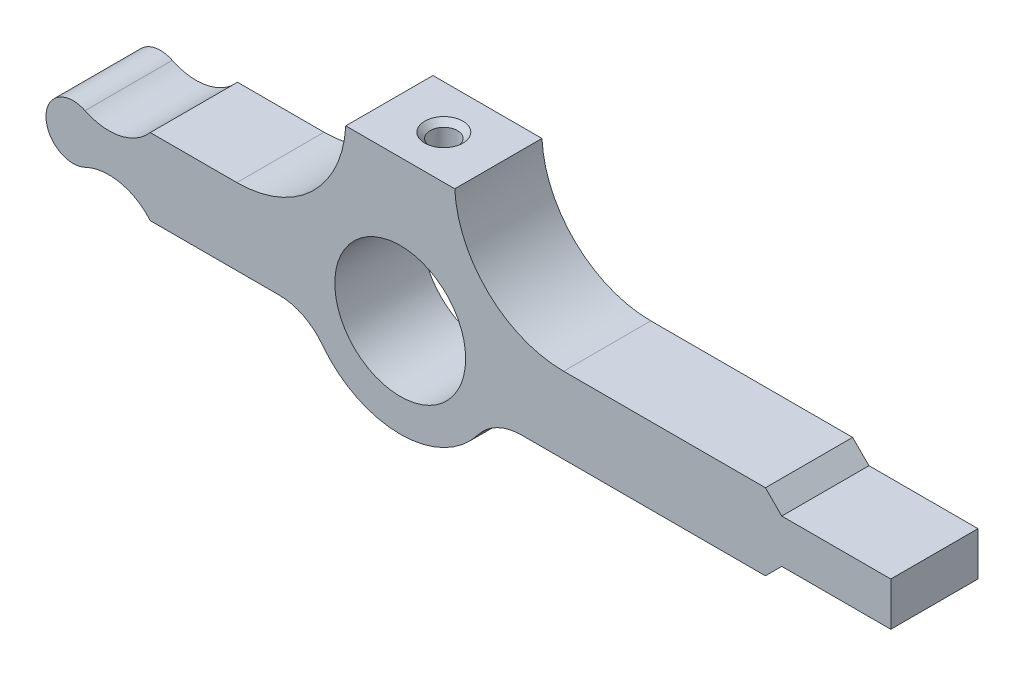
ISO-10303-21;
HEADER;
FILE_DESCRIPTION(('STEP AP214'),'2;1');
FILE_NAME('part.step','',(''),(''),'','','');
FILE_SCHEMA(('AUTOMOTIVE_DESIGN { 1 0 10303 214 1 1 1 1 }'));
ENDSEC;
DATA;
#1=APPLICATION_CONTEXT('core data for automotive mechanical design processes');
#2=APPLICATION_PROTOCOL_DEFINITION('international standard','automotive_design',2000,#1);
#3=PRODUCT_CONTEXT('',#1,'mechanical');
#4=PRODUCT('Part','Part','',(#3));
#5=PRODUCT_RELATED_PRODUCT_CATEGORY('part','',(#4));
#6=PRODUCT_DEFINITION_FORMATION('','',#4);
#7=PRODUCT_DEFINITION_CONTEXT('part definition',#1,'design');
#8=PRODUCT_DEFINITION('design','',#6,#7);
#9=PRODUCT_DEFINITION_SHAPE('','',#8);
#10=(LENGTH_UNIT() NAMED_UNIT(*) SI_UNIT(.MILLI.,.METRE.));
#11=(NAMED_UNIT(*) PLANE_ANGLE_UNIT() SI_UNIT($,.RADIAN.));
#12=(NAMED_UNIT(*) SI_UNIT($,.STERADIAN.) SOLID_ANGLE_UNIT());
#13=UNCERTAINTY_MEASURE_WITH_UNIT(LENGTH_MEASURE(1.E-05),#10,'distance_accuracy_value','');
#14=(GEOMETRIC_REPRESENTATION_CONTEXT(3) GLOBAL_UNCERTAINTY_ASSIGNED_CONTEXT((#13)) GLOBAL_UNIT_ASSIGNED_CONTEXT((#10,
#11,#12)) REPRESENTATION_CONTEXT('',''));
#15=CARTESIAN_POINT('',(0.,0.,0.));
#16=DIRECTION('',(0.,0.,1.));
#17=DIRECTION('',(1.,0.,0.));
#18=AXIS2_PLACEMENT_3D('',#15,#16,#17);
#19=CARTESIAN_POINT('',(11.1242977306435,-8.5,4.));
#20=DIRECTION('',(0.,0.,-1.));
#21=DIRECTION('',(-1.,0.,0.));
#22=AXIS2_PLACEMENT_3D('',#19,#20,#21);
#23=PLANE('',#22);
#24=CARTESIAN_POINT('',(11.1242977306435,-8.5,4.));
#25=DIRECTION('',(0.,0.,-1.));
#26=DIRECTION('',(-1.,0.,0.));
#27=AXIS2_PLACEMENT_3D('',#24,#25,#26);
#28=CIRCLE('',#27,5.);
#29=CARTESIAN_POINT('',(7.15133425541367,-5.46428571428571,4.));
#30=VERTEX_POINT('',#29);
#31=CARTESIAN_POINT('',(11.1242977306435,-3.5,4.));
#32=VERTEX_POINT('',#31);
#33=EDGE_CURVE('E231',#30,#32,#28,.T.);
#34=ORIENTED_EDGE('',*,*,#33,.T.);
#35=DIRECTION('',(1.,0.,0.));
#36=VECTOR('',#35,1.);
#37=CARTESIAN_POINT('',(11.1242977306435,-3.5,4.));
#38=LINE('',#37,#36);
#39=CARTESIAN_POINT('',(33.5,-3.5,4.));
#40=VERTEX_POINT('',#39);
#41=EDGE_CURVE('E129',#32,#40,#38,.T.);
#42=ORIENTED_EDGE('',*,*,#41,.T.);
#43=DIRECTION('',(0.707106781186546,0.707106781186549,0.));
#44=VECTOR('',#43,1.);
#45=CARTESIAN_POINT('',(33.5,-3.5,4.));
#46=LINE('',#45,#44);
#47=CARTESIAN_POINT('',(35.,-2.,4.));
#48=VERTEX_POINT('',#47);
#49=EDGE_CURVE('E276',#40,#48,#46,.T.);
#50=ORIENTED_EDGE('',*,*,#49,.T.);
#51=DIRECTION('',(1.,0.,0.));
#52=VECTOR('',#51,1.);
#53=CARTESIAN_POINT('',(35.,-2.,4.));
#54=LINE('',#53,#52);
#55=CARTESIAN_POINT('',(45.,-2.,4.));
#56=VERTEX_POINT('',#55);
#57=EDGE_CURVE('E295',#48,#56,#54,.T.);
#58=ORIENTED_EDGE('',*,*,#57,.T.);
#59=DIRECTION('',(0.,1.,0.));
#60=VECTOR('',#59,1.);
#61=CARTESIAN_POINT('',(45.,-2.,4.));
#62=LINE('',#61,#60);
#63=CARTESIAN_POINT('',(45.,2.,4.));
#64=VERTEX_POINT('',#63);
#65=EDGE_CURVE('E292',#56,#64,#62,.T.);
#66=ORIENTED_EDGE('',*,*,#65,.T.);
#67=DIRECTION('',(-1.,0.,0.));
#68=VECTOR('',#67,1.);
#69=CARTESIAN_POINT('',(45.,2.,4.));
#70=LINE('',#69,#68);
#71=CARTESIAN_POINT('',(35.,2.,4.));
#72=VERTEX_POINT('',#71);
#73=EDGE_CURVE('E294',#64,#72,#70,.T.);
#74=ORIENTED_EDGE('',*,*,#73,.T.);
#75=DIRECTION('',(-0.707106781186553,0.707106781186542,0.));
#76=VECTOR('',#75,1.);
#77=CARTESIAN_POINT('',(35.,2.,4.));
#78=LINE('',#77,#76);
#79=CARTESIAN_POINT('',(33.5,3.5,4.));
#80=VERTEX_POINT('',#79);
#81=EDGE_CURVE('E297',#72,#80,#78,.T.);
#82=ORIENTED_EDGE('',*,*,#81,.T.);
#83=DIRECTION('',(-1.,0.,0.));
#84=VECTOR('',#83,1.);
#85=CARTESIAN_POINT('',(33.5,3.5,4.));
#86=LINE('',#85,#84);
#87=CARTESIAN_POINT('',(14.9874921777191,3.5,4.));
#88=VERTEX_POINT('',#87);
#89=EDGE_CURVE('E303',#80,#88,#86,.T.);
#90=ORIENTED_EDGE('',*,*,#89,.T.);
#91=CARTESIAN_POINT('',(14.9874921777191,13.5,4.));
#92=DIRECTION('',(0.,0.,-1.));
#93=DIRECTION('',(1.,0.,0.));
#94=AXIS2_PLACEMENT_3D('',#91,#92,#93);
#95=CIRCLE('',#94,10.);
#96=CARTESIAN_POINT('',(5.,13.,4.));
#97=VERTEX_POINT('',#96);
#98=EDGE_CURVE('E305',#88,#97,#95,.T.);
#99=ORIENTED_EDGE('',*,*,#98,.T.);
#100=DIRECTION('',(-1.,0.,0.));
#101=VECTOR('',#100,1.);
#102=CARTESIAN_POINT('',(5.,13.,4.));
#103=LINE('',#102,#101);
#104=CARTESIAN_POINT('',(-5.,13.,4.));
#105=VERTEX_POINT('',#104);
#106=EDGE_CURVE('E307',#97,#105,#103,.T.);
#107=ORIENTED_EDGE('',*,*,#106,.T.);
#108=CARTESIAN_POINT('',(-14.9874921777191,13.5,4.));
#109=DIRECTION('',(0.,0.,-1.));
#110=DIRECTION('',(-1.,0.,0.));
#111=AXIS2_PLACEMENT_3D('',#108,#109,#110);
#112=CIRCLE('',#111,10.);
#113=CARTESIAN_POINT('',(-14.9874921777191,3.49999999999999,4.));
#114=VERTEX_POINT('',#113);
#115=EDGE_CURVE('E309',#105,#114,#112,.T.);
#116=ORIENTED_EDGE('',*,*,#115,.T.);
#117=DIRECTION('',(-1.,0.,0.));
#118=VECTOR('',#117,1.);
#119=CARTESIAN_POINT('',(-14.9874921777191,3.49999999999999,4.));
#120=LINE('',#119,#118);
#121=CARTESIAN_POINT('',(-22.9311547539518,3.49999999999999,4.));
#122=VERTEX_POINT('',#121);
#123=EDGE_CURVE('E311',#114,#122,#120,.T.);
#124=ORIENTED_EDGE('',*,*,#123,.T.);
#125=CARTESIAN_POINT('',(-26.7308257923445,6.75,4.));
#126=DIRECTION('',(0.,0.,-1.));
#127=DIRECTION('',(-1.,0.,0.));
#128=AXIS2_PLACEMENT_3D('',#125,#126,#127);
#129=CIRCLE('',#128,5.);
#130=CARTESIAN_POINT('',(-28.9102752641148,2.25,4.));
#131=VERTEX_POINT('',#130);
#132=EDGE_CURVE('E313',#122,#131,#129,.T.);
#133=ORIENTED_EDGE('',*,*,#132,.T.);
#134=CARTESIAN_POINT('',(-30.,0.,4.));
#135=DIRECTION('',(0.,0.,1.));
#136=DIRECTION('',(1.,0.,0.));
#137=AXIS2_PLACEMENT_3D('',#134,#135,#136);
#138=CIRCLE('',#137,2.5);
#139=CARTESIAN_POINT('',(-28.9102752641148,-2.25,4.));
#140=VERTEX_POINT('',#139);
#141=EDGE_CURVE('E315',#131,#140,#138,.T.);
#142=ORIENTED_EDGE('',*,*,#141,.T.);
#143=CARTESIAN_POINT('',(-26.7308257923445,-6.75,4.));
#144=DIRECTION('',(0.,0.,-1.));
#145=DIRECTION('',(-1.,0.,0.));
#146=AXIS2_PLACEMENT_3D('',#143,#144,#145);
#147=CIRCLE('',#146,5.);
#148=CARTESIAN_POINT('',(-22.9311547539518,-3.5,4.));
#149=VERTEX_POINT('',#148);
#150=EDGE_CURVE('E178',#140,#149,#147,.T.);
#151=ORIENTED_EDGE('',*,*,#150,.T.);
#152=DIRECTION('',(1.,0.,0.));
#153=VECTOR('',#152,1.);
#154=CARTESIAN_POINT('',(-22.9311547539518,-3.5,4.));
#155=LINE('',#154,#153);
#156=CARTESIAN_POINT('',(-11.1242977306435,-3.5,4.));
#157=VERTEX_POINT('',#156);
#158=EDGE_CURVE('E172',#149,#157,#155,.T.);
#159=ORIENTED_EDGE('',*,*,#158,.T.);
#160=CARTESIAN_POINT('',(-11.1242977306435,-8.5,4.));
#161=DIRECTION('',(0.,0.,-1.));
#162=DIRECTION('',(-1.,0.,0.));
#163=AXIS2_PLACEMENT_3D('',#160,#161,#162);
#164=CIRCLE('',#163,5.);
#165=CARTESIAN_POINT('',(-7.15133425541367,-5.46428571428571,4.));
#166=VERTEX_POINT('',#165);
#167=EDGE_CURVE('E176',#157,#166,#164,.T.);
#168=ORIENTED_EDGE('',*,*,#167,.T.);
#169=CARTESIAN_POINT('',(0.,0.,4.));
#170=DIRECTION('',(0.,0.,1.));
#171=DIRECTION('',(1.,0.,0.));
#172=AXIS2_PLACEMENT_3D('',#169,#170,#171);
#173=CIRCLE('',#172,9.);
#174=EDGE_CURVE('E56',#166,#30,#173,.T.);
#175=ORIENTED_EDGE('',*,*,#174,.T.);
#176=EDGE_LOOP('',(#34,#42,#50,#58,#66,#74,#82,#90,#99,#107,#116,#124,#133,#142,#151,#159,#168,#175));
#177=FACE_BOUND('',#176,.T.);
#178=CARTESIAN_POINT('',(0.,0.,4.));
#179=DIRECTION('',(0.,0.,1.));
#180=DIRECTION('',(1.,0.,0.));
#181=AXIS2_PLACEMENT_3D('',#178,#179,#180);
#182=CIRCLE('',#181,6.);
#183=CARTESIAN_POINT('',(6.,0.,4.));
#184=VERTEX_POINT('',#183);
#185=EDGE_CURVE('E200',#184,#184,#182,.T.);
#186=ORIENTED_EDGE('',*,*,#185,.F.);
#187=EDGE_LOOP('',(#186));
#188=FACE_BOUND('',#187,.T.);
#189=ADVANCED_FACE('F39',(#177,#188),#23,.F.);
#190=CARTESIAN_POINT('',(11.1242977306435,-8.5,-4.));
#191=DIRECTION('',(0.,0.,-1.));
#192=DIRECTION('',(-1.,0.,0.));
#193=AXIS2_PLACEMENT_3D('',#190,#191,#192);
#194=PLANE('',#193);
#195=CARTESIAN_POINT('',(11.1242977306435,-8.5,-4.));
#196=DIRECTION('',(0.,0.,-1.));
#197=DIRECTION('',(-1.,0.,0.));
#198=AXIS2_PLACEMENT_3D('',#195,#196,#197);
#199=CIRCLE('',#198,5.);
#200=CARTESIAN_POINT('',(7.15133425541367,-5.46428571428571,-4.));
#201=VERTEX_POINT('',#200);
#202=CARTESIAN_POINT('',(11.1242977306435,-3.5,-4.));
#203=VERTEX_POINT('',#202);
#204=EDGE_CURVE('E196',#201,#203,#199,.T.);
#205=ORIENTED_EDGE('',*,*,#204,.F.);
#206=CARTESIAN_POINT('',(0.,0.,-4.));
#207=DIRECTION('',(0.,0.,1.));
#208=DIRECTION('',(1.,0.,0.));
#209=AXIS2_PLACEMENT_3D('',#206,#207,#208);
#210=CIRCLE('',#209,9.);
#211=CARTESIAN_POINT('',(-7.15133425541367,-5.46428571428571,-4.));
#212=VERTEX_POINT('',#211);
#213=EDGE_CURVE('E121',#212,#201,#210,.T.);
#214=ORIENTED_EDGE('',*,*,#213,.F.);
#215=CARTESIAN_POINT('',(-11.1242977306435,-8.5,-4.));
#216=DIRECTION('',(0.,0.,-1.));
#217=DIRECTION('',(-1.,0.,0.));
#218=AXIS2_PLACEMENT_3D('',#215,#216,#217);
#219=CIRCLE('',#218,5.);
#220=CARTESIAN_POINT('',(-11.1242977306435,-3.5,-4.));
#221=VERTEX_POINT('',#220);
#222=EDGE_CURVE('E115',#221,#212,#219,.T.);
#223=ORIENTED_EDGE('',*,*,#222,.F.);
#224=DIRECTION('',(1.,0.,0.));
#225=VECTOR('',#224,1.);
#226=CARTESIAN_POINT('',(-22.9311547539518,-3.5,-4.));
#227=LINE('',#226,#225);
#228=CARTESIAN_POINT('',(-22.9311547539518,-3.5,-4.));
#229=VERTEX_POINT('',#228);
#230=EDGE_CURVE('E186',#229,#221,#227,.T.);
#231=ORIENTED_EDGE('',*,*,#230,.F.);
#232=CARTESIAN_POINT('',(-26.7308257923445,-6.75,-4.));
#233=DIRECTION('',(0.,0.,-1.));
#234=DIRECTION('',(-1.,0.,0.));
#235=AXIS2_PLACEMENT_3D('',#232,#233,#234);
#236=CIRCLE('',#235,5.);
#237=CARTESIAN_POINT('',(-28.9102752641148,-2.25,-4.));
#238=VERTEX_POINT('',#237);
#239=EDGE_CURVE('E226',#238,#229,#236,.T.);
#240=ORIENTED_EDGE('',*,*,#239,.F.);
#241=CARTESIAN_POINT('',(-30.,0.,-4.));
#242=DIRECTION('',(0.,0.,1.));
#243=DIRECTION('',(1.,0.,0.));
#244=AXIS2_PLACEMENT_3D('',#241,#242,#243);
#245=CIRCLE('',#244,2.5);
#246=CARTESIAN_POINT('',(-28.9102752641148,2.25,-4.));
#247=VERTEX_POINT('',#246);
#248=EDGE_CURVE('E224',#247,#238,#245,.T.);
#249=ORIENTED_EDGE('',*,*,#248,.F.);
#250=CARTESIAN_POINT('',(-26.7308257923445,6.75,-4.));
#251=DIRECTION('',(0.,0.,-1.));
#252=DIRECTION('',(-1.,0.,0.));
#253=AXIS2_PLACEMENT_3D('',#250,#251,#252);
#254=CIRCLE('',#253,5.);
#255=CARTESIAN_POINT('',(-22.9311547539518,3.49999999999999,-4.));
#256=VERTEX_POINT('',#255);
#257=EDGE_CURVE('E222',#256,#247,#254,.T.);
#258=ORIENTED_EDGE('',*,*,#257,.F.);
#259=DIRECTION('',(-1.,0.,0.));
#260=VECTOR('',#259,1.);
#261=CARTESIAN_POINT('',(-14.9874921777191,3.49999999999999,-4.));
#262=LINE('',#261,#260);
#263=CARTESIAN_POINT('',(-14.9874921777191,3.49999999999999,-4.));
#264=VERTEX_POINT('',#263);
#265=EDGE_CURVE('E220',#264,#256,#262,.T.);
#266=ORIENTED_EDGE('',*,*,#265,.F.);
#267=CARTESIAN_POINT('',(-14.9874921777191,13.5,-4.));
#268=DIRECTION('',(0.,0.,-1.));
#269=DIRECTION('',(-1.,0.,0.));
#270=AXIS2_PLACEMENT_3D('',#267,#268,#269);
#271=CIRCLE('',#270,10.);
#272=CARTESIAN_POINT('',(-5.,13.,-4.));
#273=VERTEX_POINT('',#272);
#274=EDGE_CURVE('E218',#273,#264,#271,.T.);
#275=ORIENTED_EDGE('',*,*,#274,.F.);
#276=DIRECTION('',(-1.,0.,0.));
#277=VECTOR('',#276,1.);
#278=CARTESIAN_POINT('',(5.,13.,-4.));
#279=LINE('',#278,#277);
#280=CARTESIAN_POINT('',(5.,13.,-4.));
#281=VERTEX_POINT('',#280);
#282=EDGE_CURVE('E216',#281,#273,#279,.T.);
#283=ORIENTED_EDGE('',*,*,#282,.F.);
#284=CARTESIAN_POINT('',(14.9874921777191,13.5,-4.));
#285=DIRECTION('',(0.,0.,-1.));
#286=DIRECTION('',(1.,0.,0.));
#287=AXIS2_PLACEMENT_3D('',#284,#285,#286);
#288=CIRCLE('',#287,10.);
#289=CARTESIAN_POINT('',(14.9874921777191,3.5,-4.));
#290=VERTEX_POINT('',#289);
#291=EDGE_CURVE('E214',#290,#281,#288,.T.);
#292=ORIENTED_EDGE('',*,*,#291,.F.);
#293=DIRECTION('',(-1.,0.,0.));
#294=VECTOR('',#293,1.);
#295=CARTESIAN_POINT('',(33.5,3.5,-4.));
#296=LINE('',#295,#294);
#297=CARTESIAN_POINT('',(33.5,3.5,-4.));
#298=VERTEX_POINT('',#297);
#299=EDGE_CURVE('E212',#298,#290,#296,.T.);
#300=ORIENTED_EDGE('',*,*,#299,.F.);
#301=DIRECTION('',(-0.707106781186553,0.707106781186542,0.));
#302=VECTOR('',#301,1.);
#303=CARTESIAN_POINT('',(35.,2.,-4.));
#304=LINE('',#303,#302);
#305=CARTESIAN_POINT('',(35.,2.,-4.));
#306=VERTEX_POINT('',#305);
#307=EDGE_CURVE('E210',#306,#298,#304,.T.);
#308=ORIENTED_EDGE('',*,*,#307,.F.);
#309=DIRECTION('',(-1.,0.,0.));
#310=VECTOR('',#309,1.);
#311=CARTESIAN_POINT('',(45.,2.,-4.));
#312=LINE('',#311,#310);
#313=CARTESIAN_POINT('',(45.,2.,-4.));
#314=VERTEX_POINT('',#313);
#315=EDGE_CURVE('E208',#314,#306,#312,.T.);
#316=ORIENTED_EDGE('',*,*,#315,.F.);
#317=DIRECTION('',(0.,1.,0.));
#318=VECTOR('',#317,1.);
#319=CARTESIAN_POINT('',(45.,-2.,-4.));
#320=LINE('',#319,#318);
#321=CARTESIAN_POINT('',(45.,-2.,-4.));
#322=VERTEX_POINT('',#321);
#323=EDGE_CURVE('E206',#322,#314,#320,.T.);
#324=ORIENTED_EDGE('',*,*,#323,.F.);
#325=DIRECTION('',(1.,0.,0.));
#326=VECTOR('',#325,1.);
#327=CARTESIAN_POINT('',(35.,-2.,-4.));
#328=LINE('',#327,#326);
#329=CARTESIAN_POINT('',(35.,-2.,-4.));
#330=VERTEX_POINT('',#329);
#331=EDGE_CURVE('E204',#330,#322,#328,.T.);
#332=ORIENTED_EDGE('',*,*,#331,.F.);
#333=DIRECTION('',(0.707106781186546,0.707106781186549,0.));
#334=VECTOR('',#333,1.);
#335=CARTESIAN_POINT('',(33.5,-3.5,-4.));
#336=LINE('',#335,#334);
#337=CARTESIAN_POINT('',(33.5,-3.5,-4.));
#338=VERTEX_POINT('',#337);
#339=EDGE_CURVE('E202',#338,#330,#336,.T.);
#340=ORIENTED_EDGE('',*,*,#339,.F.);
#341=DIRECTION('',(1.,0.,0.));
#342=VECTOR('',#341,1.);
#343=CARTESIAN_POINT('',(11.1242977306435,-3.5,-4.));
#344=LINE('',#343,#342);
#345=EDGE_CURVE('E199',#203,#338,#344,.T.);
#346=ORIENTED_EDGE('',*,*,#345,.F.);
#347=EDGE_LOOP('',(#205,#214,#223,#231,#240,#249,#258,#266,#275,#283,#292,#300,#308,#316,#324,
#332,#340,#346));
#348=FACE_BOUND('',#347,.T.);
#349=CARTESIAN_POINT('',(0.,0.,-4.));
#350=DIRECTION('',(0.,0.,1.));
#351=DIRECTION('',(1.,0.,0.));
#352=AXIS2_PLACEMENT_3D('',#349,#350,#351);
#353=CIRCLE('',#352,6.);
#354=CARTESIAN_POINT('',(6.,0.,-4.));
#355=VERTEX_POINT('',#354);
#356=EDGE_CURVE('E360',#355,#355,#353,.T.);
#357=ORIENTED_EDGE('',*,*,#356,.T.);
#358=EDGE_LOOP('',(#357));
#359=FACE_BOUND('',#358,.T.);
#360=ADVANCED_FACE('F280',(#348,#359),#194,.T.);
#361=CARTESIAN_POINT('',(11.1242977306435,-8.5,4.));
#362=DIRECTION('',(0.,0.,-1.));
#363=DIRECTION('',(-1.,0.,0.));
#364=AXIS2_PLACEMENT_3D('',#361,#362,#363);
#365=CYLINDRICAL_SURFACE('',#364,5.);
#366=ORIENTED_EDGE('',*,*,#204,.T.);
#367=DIRECTION('',(0.,0.,-1.));
#368=VECTOR('',#367,1.);
#369=CARTESIAN_POINT('',(11.1242977306435,-3.5,4.));
#370=LINE('',#369,#368);
#371=EDGE_CURVE('E11',#32,#203,#370,.T.);
#372=ORIENTED_EDGE('',*,*,#371,.F.);
#373=ORIENTED_EDGE('',*,*,#33,.F.);
#374=DIRECTION('',(0.,0.,-1.));
#375=VECTOR('',#374,1.);
#376=CARTESIAN_POINT('',(7.15133425541367,-5.46428571428571,4.));
#377=LINE('',#376,#375);
#378=EDGE_CURVE('E192',#30,#201,#377,.T.);
#379=ORIENTED_EDGE('',*,*,#378,.T.);
#380=EDGE_LOOP('',(#366,#372,#373,#379));
#381=FACE_BOUND('',#380,.T.);
#382=ADVANCED_FACE('F41',(#381),#365,.F.);
#383=CARTESIAN_POINT('',(11.1242977306435,-3.5,4.));
#384=DIRECTION('',(0.,1.,0.));
#385=DIRECTION('',(-1.,0.,0.));
#386=AXIS2_PLACEMENT_3D('',#383,#384,#385);
#387=PLANE('',#386);
#388=ORIENTED_EDGE('',*,*,#345,.T.);
#389=DIRECTION('',(0.,0.,-1.));
#390=VECTOR('',#389,1.);
#391=CARTESIAN_POINT('',(33.5,-3.5,4.));
#392=LINE('',#391,#390);
#393=EDGE_CURVE('E48',#40,#338,#392,.T.);
#394=ORIENTED_EDGE('',*,*,#393,.F.);
#395=ORIENTED_EDGE('',*,*,#41,.F.);
#396=ORIENTED_EDGE('',*,*,#371,.T.);
#397=EDGE_LOOP('',(#388,#394,#395,#396));
#398=FACE_BOUND('',#397,.T.);
#399=ADVANCED_FACE('F434',(#398),#387,.F.);
#400=CARTESIAN_POINT('',(33.5,-3.5,4.));
#401=DIRECTION('',(-0.707106781186549,0.707106781186546,0.));
#402=DIRECTION('',(-0.707106781186546,-0.707106781186549,0.));
#403=AXIS2_PLACEMENT_3D('',#400,#401,#402);
#404=PLANE('',#403);
#405=ORIENTED_EDGE('',*,*,#339,.T.);
#406=DIRECTION('',(0.,0.,-1.));
#407=VECTOR('',#406,1.);
#408=CARTESIAN_POINT('',(35.,-2.,4.));
#409=LINE('',#408,#407);
#410=EDGE_CURVE('E268',#48,#330,#409,.T.);
#411=ORIENTED_EDGE('',*,*,#410,.F.);
#412=ORIENTED_EDGE('',*,*,#49,.F.);
#413=ORIENTED_EDGE('',*,*,#393,.T.);
#414=EDGE_LOOP('',(#405,#411,#412,#413));
#415=FACE_BOUND('',#414,.T.);
#416=ADVANCED_FACE('F274',(#415),#404,.F.);
#417=CARTESIAN_POINT('',(35.,-2.,4.));
#418=DIRECTION('',(0.,1.,0.));
#419=DIRECTION('',(-1.,0.,0.));
#420=AXIS2_PLACEMENT_3D('',#417,#418,#419);
#421=PLANE('',#420);
#422=ORIENTED_EDGE('',*,*,#331,.T.);
#423=DIRECTION('',(0.,0.,-1.));
#424=VECTOR('',#423,1.);
#425=CARTESIAN_POINT('',(45.,-2.,4.));
#426=LINE('',#425,#424);
#427=EDGE_CURVE('E265',#56,#322,#426,.T.);
#428=ORIENTED_EDGE('',*,*,#427,.F.);
#429=ORIENTED_EDGE('',*,*,#57,.F.);
#430=ORIENTED_EDGE('',*,*,#410,.T.);
#431=EDGE_LOOP('',(#422,#428,#429,#430));
#432=FACE_BOUND('',#431,.T.);
#433=ADVANCED_FACE('F286',(#432),#421,.F.);
#434=CARTESIAN_POINT('',(45.,-2.,4.));
#435=DIRECTION('',(-1.,0.,0.));
#436=DIRECTION('',(0.,0.,1.));
#437=AXIS2_PLACEMENT_3D('',#434,#435,#436);
#438=PLANE('',#437);
#439=ORIENTED_EDGE('',*,*,#323,.T.);
#440=DIRECTION('',(0.,0.,-1.));
#441=VECTOR('',#440,1.);
#442=CARTESIAN_POINT('',(45.,2.,4.));
#443=LINE('',#442,#441);
#444=EDGE_CURVE('E262',#64,#314,#443,.T.);
#445=ORIENTED_EDGE('',*,*,#444,.F.);
#446=ORIENTED_EDGE('',*,*,#65,.F.);
#447=ORIENTED_EDGE('',*,*,#427,.T.);
#448=EDGE_LOOP('',(#439,#445,#446,#447));
#449=FACE_BOUND('',#448,.T.);
#450=ADVANCED_FACE('F290',(#449),#438,.F.);
#451=CARTESIAN_POINT('',(45.,2.,4.));
#452=DIRECTION('',(0.,-1.,0.));
#453=DIRECTION('',(1.,0.,0.));
#454=AXIS2_PLACEMENT_3D('',#451,#452,#453);
#455=PLANE('',#454);
#456=ORIENTED_EDGE('',*,*,#315,.T.);
#457=DIRECTION('',(0.,0.,-1.));
#458=VECTOR('',#457,1.);
#459=CARTESIAN_POINT('',(35.,2.,4.));
#460=LINE('',#459,#458);
#461=EDGE_CURVE('E259',#72,#306,#460,.T.);
#462=ORIENTED_EDGE('',*,*,#461,.F.);
#463=ORIENTED_EDGE('',*,*,#73,.F.);
#464=ORIENTED_EDGE('',*,*,#444,.T.);
#465=EDGE_LOOP('',(#456,#462,#463,#464));
#466=FACE_BOUND('',#465,.T.);
#467=ADVANCED_FACE('F424',(#466),#455,.F.);
#468=CARTESIAN_POINT('',(35.,2.,4.));
#469=DIRECTION('',(-0.707106781186543,-0.707106781186553,0.));
#470=DIRECTION('',(0.707106781186553,-0.707106781186543,0.));
#471=AXIS2_PLACEMENT_3D('',#468,#469,#470);
#472=PLANE('',#471);
#473=ORIENTED_EDGE('',*,*,#307,.T.);
#474=DIRECTION('',(0.,0.,-1.));
#475=VECTOR('',#474,1.);
#476=CARTESIAN_POINT('',(33.5,3.5,4.));
#477=LINE('',#476,#475);
#478=EDGE_CURVE('E256',#80,#298,#477,.T.);
#479=ORIENTED_EDGE('',*,*,#478,.F.);
#480=ORIENTED_EDGE('',*,*,#81,.F.);
#481=ORIENTED_EDGE('',*,*,#461,.T.);
#482=EDGE_LOOP('',(#473,#479,#480,#481));
#483=FACE_BOUND('',#482,.T.);
#484=ADVANCED_FACE('F420',(#483),#472,.F.);
#485=CARTESIAN_POINT('',(33.5,3.5,4.));
#486=DIRECTION('',(0.,-1.,0.));
#487=DIRECTION('',(0.,0.,-1.));
#488=AXIS2_PLACEMENT_3D('',#485,#486,#487);
#489=PLANE('',#488);
#490=ORIENTED_EDGE('',*,*,#299,.T.);
#491=DIRECTION('',(0.,0.,-1.));
#492=VECTOR('',#491,1.);
#493=CARTESIAN_POINT('',(14.9874921777191,3.5,4.));
#494=LINE('',#493,#492);
#495=EDGE_CURVE('E253',#88,#290,#494,.T.);
#496=ORIENTED_EDGE('',*,*,#495,.F.);
#497=ORIENTED_EDGE('',*,*,#89,.F.);
#498=ORIENTED_EDGE('',*,*,#478,.T.);
#499=EDGE_LOOP('',(#490,#496,#497,#498));
#500=FACE_BOUND('',#499,.T.);
#501=ADVANCED_FACE('F416',(#500),#489,.F.);
#502=CARTESIAN_POINT('',(14.9874921777191,13.5,4.));
#503=DIRECTION('',(0.,0.,-1.));
#504=DIRECTION('',(-1.,0.,0.));
#505=AXIS2_PLACEMENT_3D('',#502,#503,#504);
#506=CYLINDRICAL_SURFACE('',#505,10.);
#507=ORIENTED_EDGE('',*,*,#291,.T.);
#508=DIRECTION('',(0.,0.,-1.));
#509=VECTOR('',#508,1.);
#510=CARTESIAN_POINT('',(5.,13.,4.));
#511=LINE('',#510,#509);
#512=EDGE_CURVE('E250',#97,#281,#511,.T.);
#513=ORIENTED_EDGE('',*,*,#512,.F.);
#514=ORIENTED_EDGE('',*,*,#98,.F.);
#515=ORIENTED_EDGE('',*,*,#495,.T.);
#516=EDGE_LOOP('',(#507,#513,#514,#515));
#517=FACE_BOUND('',#516,.T.);
#518=ADVANCED_FACE('F383',(#517),#506,.F.);
#519=CARTESIAN_POINT('',(5.,13.,4.));
#520=DIRECTION('',(0.,-1.,0.));
#521=DIRECTION('',(1.,0.,0.));
#522=AXIS2_PLACEMENT_3D('',#519,#520,#521);
#523=PLANE('',#522);
#524=CARTESIAN_POINT('',(0.,13.,0.));
#525=DIRECTION('',(0.,1.,0.));
#526=DIRECTION('',(0.,0.,1.));
#527=AXIS2_PLACEMENT_3D('',#524,#525,#526);
#528=CIRCLE('',#527,1.75);
#529=CARTESIAN_POINT('',(0.,13.,1.75));
#530=VERTEX_POINT('',#529);
#531=EDGE_CURVE('E373',#530,#530,#528,.T.);
#532=ORIENTED_EDGE('',*,*,#531,.F.);
#533=EDGE_LOOP('',(#532));
#534=FACE_BOUND('',#533,.T.);
#535=ORIENTED_EDGE('',*,*,#282,.T.);
#536=DIRECTION('',(0.,0.,-1.));
#537=VECTOR('',#536,1.);
#538=CARTESIAN_POINT('',(-5.,13.,4.));
#539=LINE('',#538,#537);
#540=EDGE_CURVE('E247',#105,#273,#539,.T.);
#541=ORIENTED_EDGE('',*,*,#540,.F.);
#542=ORIENTED_EDGE('',*,*,#106,.F.);
#543=ORIENTED_EDGE('',*,*,#512,.T.);
#544=EDGE_LOOP('',(#535,#541,#542,#543));
#545=FACE_BOUND('',#544,.T.);
#546=ADVANCED_FACE('F379',(#534,#545),#523,.F.);
#547=CARTESIAN_POINT('',(-14.9874921777191,13.5,4.));
#548=DIRECTION('',(0.,0.,-1.));
#549=DIRECTION('',(-1.,0.,0.));
#550=AXIS2_PLACEMENT_3D('',#547,#548,#549);
#551=CYLINDRICAL_SURFACE('',#550,10.);
#552=ORIENTED_EDGE('',*,*,#274,.T.);
#553=DIRECTION('',(0.,0.,-1.));
#554=VECTOR('',#553,1.);
#555=CARTESIAN_POINT('',(-14.9874921777191,3.49999999999999,4.));
#556=LINE('',#555,#554);
#557=EDGE_CURVE('E244',#114,#264,#556,.T.);
#558=ORIENTED_EDGE('',*,*,#557,.F.);
#559=ORIENTED_EDGE('',*,*,#115,.F.);
#560=ORIENTED_EDGE('',*,*,#540,.T.);
#561=EDGE_LOOP('',(#552,#558,#559,#560));
#562=FACE_BOUND('',#561,.T.);
#563=ADVANCED_FACE('F382',(#562),#551,.F.);
#564=CARTESIAN_POINT('',(-14.9874921777191,3.49999999999999,4.));
#565=DIRECTION('',(0.,-1.,0.));
#566=DIRECTION('',(0.,0.,-1.));
#567=AXIS2_PLACEMENT_3D('',#564,#565,#566);
#568=PLANE('',#567);
#569=ORIENTED_EDGE('',*,*,#265,.T.);
#570=DIRECTION('',(0.,0.,-1.));
#571=VECTOR('',#570,1.);
#572=CARTESIAN_POINT('',(-22.9311547539518,3.49999999999999,4.));
#573=LINE('',#572,#571);
#574=EDGE_CURVE('E241',#122,#256,#573,.T.);
#575=ORIENTED_EDGE('',*,*,#574,.F.);
#576=ORIENTED_EDGE('',*,*,#123,.F.);
#577=ORIENTED_EDGE('',*,*,#557,.T.);
#578=EDGE_LOOP('',(#569,#575,#576,#577));
#579=FACE_BOUND('',#578,.T.);
#580=ADVANCED_FACE('F398',(#579),#568,.F.);
#581=CARTESIAN_POINT('',(-26.7308257923445,6.75,4.));
#582=DIRECTION('',(0.,0.,-1.));
#583=DIRECTION('',(-1.,0.,0.));
#584=AXIS2_PLACEMENT_3D('',#581,#582,#583);
#585=CYLINDRICAL_SURFACE('',#584,5.);
#586=ORIENTED_EDGE('',*,*,#257,.T.);
#587=DIRECTION('',(0.,0.,-1.));
#588=VECTOR('',#587,1.);
#589=CARTESIAN_POINT('',(-28.9102752641148,2.25,4.));
#590=LINE('',#589,#588);
#591=EDGE_CURVE('E238',#131,#247,#590,.T.);
#592=ORIENTED_EDGE('',*,*,#591,.F.);
#593=ORIENTED_EDGE('',*,*,#132,.F.);
#594=ORIENTED_EDGE('',*,*,#574,.T.);
#595=EDGE_LOOP('',(#586,#592,#593,#594));
#596=FACE_BOUND('',#595,.T.);
#597=ADVANCED_FACE('F401',(#596),#585,.F.);
#598=CARTESIAN_POINT('',(-30.,0.,4.));
#599=DIRECTION('',(0.,0.,-1.));
#600=DIRECTION('',(-1.,0.,0.));
#601=AXIS2_PLACEMENT_3D('',#598,#599,#600);
#602=CYLINDRICAL_SURFACE('',#601,2.5);
#603=ORIENTED_EDGE('',*,*,#248,.T.);
#604=DIRECTION('',(0.,0.,-1.));
#605=VECTOR('',#604,1.);
#606=CARTESIAN_POINT('',(-28.9102752641148,-2.25,4.));
#607=LINE('',#606,#605);
#608=EDGE_CURVE('E235',#140,#238,#607,.T.);
#609=ORIENTED_EDGE('',*,*,#608,.F.);
#610=ORIENTED_EDGE('',*,*,#141,.F.);
#611=ORIENTED_EDGE('',*,*,#591,.T.);
#612=EDGE_LOOP('',(#603,#609,#610,#611));
#613=FACE_BOUND('',#612,.T.);
#614=ADVANCED_FACE('F321',(#613),#602,.T.);
#615=CARTESIAN_POINT('',(-26.7308257923445,-6.75,4.));
#616=DIRECTION('',(0.,0.,-1.));
#617=DIRECTION('',(-1.,0.,0.));
#618=AXIS2_PLACEMENT_3D('',#615,#616,#617);
#619=CYLINDRICAL_SURFACE('',#618,5.);
#620=ORIENTED_EDGE('',*,*,#239,.T.);
#621=DIRECTION('',(0.,0.,-1.));
#622=VECTOR('',#621,1.);
#623=CARTESIAN_POINT('',(-22.9311547539518,-3.5,4.));
#624=LINE('',#623,#622);
#625=EDGE_CURVE('E187',#149,#229,#624,.T.);
#626=ORIENTED_EDGE('',*,*,#625,.F.);
#627=ORIENTED_EDGE('',*,*,#150,.F.);
#628=ORIENTED_EDGE('',*,*,#608,.T.);
#629=EDGE_LOOP('',(#620,#626,#627,#628));
#630=FACE_BOUND('',#629,.T.);
#631=ADVANCED_FACE('F325',(#630),#619,.F.);
#632=CARTESIAN_POINT('',(-22.9311547539518,-3.5,4.));
#633=DIRECTION('',(0.,1.,0.));
#634=DIRECTION('',(-1.,0.,0.));
#635=AXIS2_PLACEMENT_3D('',#632,#633,#634);
#636=PLANE('',#635);
#637=ORIENTED_EDGE('',*,*,#230,.T.);
#638=DIRECTION('',(0.,0.,-1.));
#639=VECTOR('',#638,1.);
#640=CARTESIAN_POINT('',(-11.1242977306435,-3.5,4.));
#641=LINE('',#640,#639);
#642=EDGE_CURVE('E183',#157,#221,#641,.T.);
#643=ORIENTED_EDGE('',*,*,#642,.F.);
#644=ORIENTED_EDGE('',*,*,#158,.F.);
#645=ORIENTED_EDGE('',*,*,#625,.T.);
#646=EDGE_LOOP('',(#637,#643,#644,#645));
#647=FACE_BOUND('',#646,.T.);
#648=ADVANCED_FACE('F184',(#647),#636,.F.);
#649=CARTESIAN_POINT('',(-11.1242977306435,-8.5,4.));
#650=DIRECTION('',(0.,0.,-1.));
#651=DIRECTION('',(-1.,0.,0.));
#652=AXIS2_PLACEMENT_3D('',#649,#650,#651);
#653=CYLINDRICAL_SURFACE('',#652,5.);
#654=ORIENTED_EDGE('',*,*,#222,.T.);
#655=DIRECTION('',(0.,0.,-1.));
#656=VECTOR('',#655,1.);
#657=CARTESIAN_POINT('',(-7.15133425541367,-5.46428571428571,4.));
#658=LINE('',#657,#656);
#659=EDGE_CURVE('E188',#166,#212,#658,.T.);
#660=ORIENTED_EDGE('',*,*,#659,.F.);
#661=ORIENTED_EDGE('',*,*,#167,.F.);
#662=ORIENTED_EDGE('',*,*,#642,.T.);
#663=EDGE_LOOP('',(#654,#660,#661,#662));
#664=FACE_BOUND('',#663,.T.);
#665=ADVANCED_FACE('F190',(#664),#653,.F.);
#666=CARTESIAN_POINT('',(0.,0.,4.));
#667=DIRECTION('',(0.,0.,-1.));
#668=DIRECTION('',(-1.,0.,0.));
#669=AXIS2_PLACEMENT_3D('',#666,#667,#668);
#670=CYLINDRICAL_SURFACE('',#669,9.);
#671=ORIENTED_EDGE('',*,*,#213,.T.);
#672=ORIENTED_EDGE('',*,*,#378,.F.);
#673=ORIENTED_EDGE('',*,*,#174,.F.);
#674=ORIENTED_EDGE('',*,*,#659,.T.);
#675=EDGE_LOOP('',(#671,#672,#673,#674));
#676=FACE_BOUND('',#675,.T.);
#677=ADVANCED_FACE('F329',(#676),#670,.T.);
#678=CARTESIAN_POINT('',(0.,0.,4.));
#679=DIRECTION('',(0.,0.,-1.));
#680=DIRECTION('',(-1.,0.,0.));
#681=AXIS2_PLACEMENT_3D('',#678,#679,#680);
#682=CYLINDRICAL_SURFACE('',#681,6.);
#683=CARTESIAN_POINT('',(0.,6.,1.25));
#684=CARTESIAN_POINT('',(-0.0694090417016651,5.99999871526651,1.24999752253078));
#685=CARTESIAN_POINT('',(-0.13884878952088,5.99878328775043,1.24419933428125));
#686=CARTESIAN_POINT('',(-0.275761316266998,5.9940520099068,1.22118065046715));
#687=CARTESIAN_POINT('',(-0.343232560128317,5.99053441189248,1.20395147696307));
#688=CARTESIAN_POINT('',(-0.474209132291346,5.98159109196202,1.15862954507818));
#689=CARTESIAN_POINT('',(-0.537718336709189,5.97616727052645,1.13054760400111));
#690=CARTESIAN_POINT('',(-0.659120328605962,5.96399927809859,1.06435039114382));
#691=CARTESIAN_POINT('',(-0.717013367534331,5.95725516625975,1.02623556884417));
#692=CARTESIAN_POINT('',(-0.826390324308841,5.9430770002465,0.940463659809354));
#693=CARTESIAN_POINT('',(-0.877780244162689,5.93563505848531,0.892687998764918));
#694=CARTESIAN_POINT('',(-0.971877776769397,5.92095657692448,0.78920534080489));
#695=CARTESIAN_POINT('',(-1.01458467096099,5.91372005416683,0.733497688127735));
#696=CARTESIAN_POINT('',(-1.09051031677217,5.90019442595308,0.615048031233841));
#697=CARTESIAN_POINT('',(-1.12363054680651,5.89391545174828,0.552241615497257));
#698=CARTESIAN_POINT('',(-1.17881119348064,5.8831284065002,0.421802548227244));
#699=CARTESIAN_POINT('',(-1.20087280167642,5.87862014467568,0.354170417557463));
#700=CARTESIAN_POINT('',(-1.23300240133737,5.87196500986122,0.217014762584361));
#701=CARTESIAN_POINT('',(-1.24323597696799,5.86978556855865,0.147531640665233));
#702=CARTESIAN_POINT('',(-1.25193357655615,5.86793690716491,0.00780315713736774));
#703=CARTESIAN_POINT('',(-1.25039890894687,5.86826740800981,-0.0624421188652967));
#704=CARTESIAN_POINT('',(-1.23573719037197,5.87137174319175,-0.200481027975177));
#705=CARTESIAN_POINT('',(-1.22280105232721,5.87410533679901,-0.268295979661213));
#706=CARTESIAN_POINT('',(-1.18600543529946,5.88164437615942,-0.400771509644927));
#707=CARTESIAN_POINT('',(-1.16214539481382,5.88644992841317,-0.465431925606332));
#708=CARTESIAN_POINT('',(-1.10400003213929,5.89763191464102,-0.590307228415981));
#709=CARTESIAN_POINT('',(-1.06964002534237,5.90401953785585,-0.650486296527073));
#710=CARTESIAN_POINT('',(-0.991522699274821,5.91763890010721,-0.76429574426816));
#711=CARTESIAN_POINT('',(-0.947764212262591,5.92487074398537,-0.817925308835976));
#712=CARTESIAN_POINT('',(-0.851074921546786,5.93953730929909,-0.918213961080372));
#713=CARTESIAN_POINT('',(-0.797981433412086,5.94697323199473,-0.964716168897013));
#714=CARTESIAN_POINT('',(-0.684667288611801,5.96108088143001,-1.04818044222897));
#715=CARTESIAN_POINT('',(-0.624446525025768,5.96775259670236,-1.0851423645984));
#716=CARTESIAN_POINT('',(-0.498405541235481,5.97959870942815,-1.14851008153595));
#717=CARTESIAN_POINT('',(-0.432575461926503,5.98477039710258,-1.17489680456712));
#718=CARTESIAN_POINT('',(-0.297284620972158,5.99301338211281,-1.21619170483549));
#719=CARTESIAN_POINT('',(-0.227824338595093,5.99608495596053,-1.2311013932314));
#720=CARTESIAN_POINT('',(-0.0885918657008387,5.99974275215456,-1.24879425206788));
#721=CARTESIAN_POINT('',(-0.0188480555261822,6.00037293537579,-1.25179194149425));
#722=CARTESIAN_POINT('',(0.120143798757711,5.99919952252774,-1.2461550500309));
#723=CARTESIAN_POINT('',(0.189391872962254,5.99739607548153,-1.2375211813984));
#724=CARTESIAN_POINT('',(0.32472636711981,5.99158564979184,-1.20904434653047));
#725=CARTESIAN_POINT('',(0.390837192894202,5.98760052868077,-1.18931251461653));
#726=CARTESIAN_POINT('',(0.518811446661328,5.97787227242395,-1.13932213957859));
#727=CARTESIAN_POINT('',(0.580674536336771,5.97212899744579,-1.10906275913402));
#728=CARTESIAN_POINT('',(0.69929430694349,5.95941241490714,-1.03841962176244));
#729=CARTESIAN_POINT('',(0.755973219469829,5.9524239381233,-0.997908070430937));
#730=CARTESIAN_POINT('',(0.861805445886515,5.93802568299709,-0.908080436923728));
#731=CARTESIAN_POINT('',(0.910957877913281,5.93061585542511,-0.858763324481058));
#732=CARTESIAN_POINT('',(1.0011786486518,5.91606024531377,-0.751744423000298));
#733=CARTESIAN_POINT('',(1.04209914600204,5.90892089307501,-0.693916968044717));
#734=CARTESIAN_POINT('',(1.11364719079243,5.89585601015806,-0.572083715786212));
#735=CARTESIAN_POINT('',(1.14427516677864,5.88993042894651,-0.508078175860893));
#736=CARTESIAN_POINT('',(1.19417246443922,5.88001700708041,-0.376038803701768));
#737=CARTESIAN_POINT('',(1.21350309828031,5.87601872784687,-0.308028962834163));
#738=CARTESIAN_POINT('',(1.24044038523407,5.87039184709697,-0.169633449507739));
#739=CARTESIAN_POINT('',(1.2480487154444,5.86876290660367,-0.0992481183805581));
#740=CARTESIAN_POINT('',(1.25125926487611,5.86807907308506,0.0404134009996482));
#741=CARTESIAN_POINT('',(1.24709542622725,5.86897402321502,0.109684070222055));
#742=CARTESIAN_POINT('',(1.22739905314031,5.87312447254928,0.246514008920219));
#743=CARTESIAN_POINT('',(1.21186662782266,5.87637994909626,0.314073294816106));
#744=CARTESIAN_POINT('',(1.16998217768584,5.88486132447716,0.445397771890661));
#745=CARTESIAN_POINT('',(1.14366117568421,5.8900815700793,0.509173246486927));
#746=CARTESIAN_POINT('',(1.08097457299757,5.90190705738738,0.631438776026666));
#747=CARTESIAN_POINT('',(1.04460803983029,5.9085124276546,0.689928339633126));
#748=CARTESIAN_POINT('',(0.962073695342405,5.92251579551146,0.801121627079445));
#749=CARTESIAN_POINT('',(0.91573789041822,5.92992613868404,0.853699124564985));
#750=CARTESIAN_POINT('',(0.814924438115328,5.94461839583213,0.950409493226359));
#751=CARTESIAN_POINT('',(0.760444918832962,5.9519002798488,0.994540417551485));
#752=CARTESIAN_POINT('',(0.644134427507697,5.96561444547638,1.07358857318406));
#753=CARTESIAN_POINT('',(0.582225921521342,5.97203596073244,1.10839367988629));
#754=CARTESIAN_POINT('',(0.453319843998448,5.98319908494092,1.16705022843002));
#755=CARTESIAN_POINT('',(0.386326781907238,5.98794216182101,1.19091124718187));
#756=CARTESIAN_POINT('',(0.2660152929001,5.99432499781444,1.22254027828842));
#757=CARTESIAN_POINT('',(0.213367593727924,5.99644035661395,1.23281876320886));
#758=CARTESIAN_POINT('',(0.107152674176532,5.99927832789758,1.24654945427733));
#759=CARTESIAN_POINT('',(0.0535854878488671,6.00000099184586,1.25000191266719));
#760=CARTESIAN_POINT('',(0.,6.,1.25));
#761=B_SPLINE_CURVE_WITH_KNOTS('',3,(#683,#684,#685,#686,#687,#688,#689,#690,#691,#692,#693,
#694,#695,#696,#697,#698,#699,#700,#701,#702,#703,#704,#705,#706,#707,#708,#709,#710,#711,#712,
#713,#714,#715,#716,#717,#718,#719,#720,#721,#722,#723,#724,#725,#726,#727,#728,#729,#730,#731,
#732,#733,#734,#735,#736,#737,#738,#739,#740,#741,#742,#743,#744,#745,#746,#747,#748,#749,#750,
#751,#752,#753,#754,#755,#756,#757,#758,#759,#760),.UNSPECIFIED.,.T.,.F.,(4,2,2,2,2,2,2,2,2,2,2,
2,2,2,2,2,2,2,2,2,2,2,2,2,2,2,2,2,2,2,2,2,2,2,2,2,2,2,4),(0.,0.208031045103183,
0.416220199906225,0.624202378825442,0.832175241572989,1.04287526388123,1.25359271551786,
1.46640449178548,1.6791933328549,1.88896575169854,2.09871484767164,2.30501712129059,
2.5113300003028,2.71914592416749,2.92698768368034,3.13889526355466,3.35080602278218,
3.56309724499662,3.77536051045771,3.98378339407675,4.19219351552277,4.39855286632621,
4.60492863390933,4.81401583995736,5.02312752564574,5.23571263829336,5.44828889851309,
5.65970050095025,5.87108185414185,6.07829223291038,6.28550062281361,6.49211731393255,
6.6987531908148,6.90919024830309,7.11967575117369,7.33258864398256,7.54531486464973,
7.70592588477279,7.86653096973391),.UNSPECIFIED.);
#762=CARTESIAN_POINT('',(0.,6.,1.25));
#763=VERTEX_POINT('',#762);
#764=EDGE_CURVE('E353',#763,#763,#761,.T.);
#765=ORIENTED_EDGE('',*,*,#764,.F.);
#766=EDGE_LOOP('',(#765));
#767=FACE_BOUND('',#766,.T.);
#768=ORIENTED_EDGE('',*,*,#185,.T.);
#769=EDGE_LOOP('',(#768));
#770=FACE_BOUND('',#769,.T.);
#771=ORIENTED_EDGE('',*,*,#356,.F.);
#772=EDGE_LOOP('',(#771));
#773=FACE_BOUND('',#772,.T.);
#774=ADVANCED_FACE('F331',(#767,#770,#773),#682,.F.);
#775=CARTESIAN_POINT('',(0.,13.,0.));
#776=DIRECTION('',(0.,1.,0.));
#777=DIRECTION('',(0.,0.,1.));
#778=AXIS2_PLACEMENT_3D('',#775,#776,#777);
#779=CYLINDRICAL_SURFACE('',#778,1.25);
#780=CARTESIAN_POINT('',(0.,12.5,0.));
#781=DIRECTION('',(0.,1.,0.));
#782=DIRECTION('',(0.,0.,1.));
#783=AXIS2_PLACEMENT_3D('',#780,#781,#782);
#784=CIRCLE('',#783,1.25);
#785=CARTESIAN_POINT('',(0.,12.5,1.25));
#786=VERTEX_POINT('',#785);
#787=EDGE_CURVE('E361',#786,#786,#784,.T.);
#788=ORIENTED_EDGE('',*,*,#787,.T.);
#789=EDGE_LOOP('',(#788));
#790=FACE_BOUND('',#789,.T.);
#791=ORIENTED_EDGE('',*,*,#764,.T.);
#792=EDGE_LOOP('',(#791));
#793=FACE_BOUND('',#792,.T.);
#794=ADVANCED_FACE('F337',(#790,#793),#779,.F.);
#795=CARTESIAN_POINT('',(0.,13.,0.));
#796=DIRECTION('',(0.,1.,0.));
#797=DIRECTION('',(0.,0.,1.));
#798=AXIS2_PLACEMENT_3D('',#795,#796,#797);
#799=CONICAL_SURFACE('',#798,1.75,0.78539816339745);
#800=ORIENTED_EDGE('',*,*,#787,.F.);
#801=EDGE_LOOP('',(#800));
#802=FACE_BOUND('',#801,.T.);
#803=ORIENTED_EDGE('',*,*,#531,.T.);
#804=EDGE_LOOP('',(#803));
#805=FACE_BOUND('',#804,.T.);
#806=ADVANCED_FACE('F377',(#802,#805),#799,.F.);
#807=CLOSED_SHELL('',(#189,#360,#382,#399,#416,#433,#450,#467,#484,#501,#518,#546,#563,#580,
#597,#614,#631,#648,#665,#677,#774,#794,#806));
#808=MANIFOLD_SOLID_BREP('B2',#807);
#809=ADVANCED_BREP_SHAPE_REPRESENTATION('',(#18,#808),#14);
#810=SHAPE_DEFINITION_REPRESENTATION(#9,#809);
ENDSEC;
END-ISO-10303-21;
